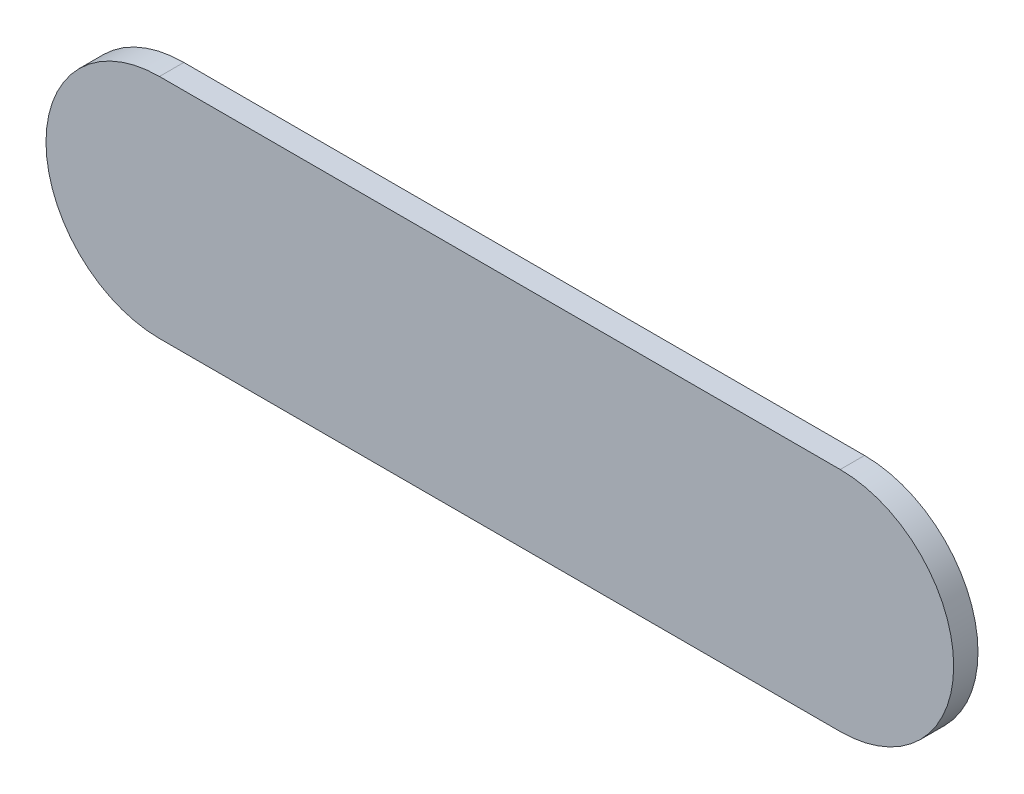
ISO-10303-21;
HEADER;
FILE_DESCRIPTION(('STEP AP214'),'2;1');
FILE_NAME('part.step','',(''),(''),'','','');
FILE_SCHEMA(('AUTOMOTIVE_DESIGN { 1 0 10303 214 1 1 1 1 }'));
ENDSEC;
DATA;
#1=APPLICATION_CONTEXT('core data for automotive mechanical design processes');
#2=APPLICATION_PROTOCOL_DEFINITION('international standard','automotive_design',2000,#1);
#3=PRODUCT_CONTEXT('',#1,'mechanical');
#4=PRODUCT('Part','Part','',(#3));
#5=PRODUCT_RELATED_PRODUCT_CATEGORY('part','',(#4));
#6=PRODUCT_DEFINITION_FORMATION('','',#4);
#7=PRODUCT_DEFINITION_CONTEXT('part definition',#1,'design');
#8=PRODUCT_DEFINITION('design','',#6,#7);
#9=PRODUCT_DEFINITION_SHAPE('','',#8);
#10=(LENGTH_UNIT() NAMED_UNIT(*) SI_UNIT(.MILLI.,.METRE.));
#11=(NAMED_UNIT(*) PLANE_ANGLE_UNIT() SI_UNIT($,.RADIAN.));
#12=(NAMED_UNIT(*) SI_UNIT($,.STERADIAN.) SOLID_ANGLE_UNIT());
#13=UNCERTAINTY_MEASURE_WITH_UNIT(LENGTH_MEASURE(1.E-05),#10,'distance_accuracy_value','');
#14=(GEOMETRIC_REPRESENTATION_CONTEXT(3) GLOBAL_UNCERTAINTY_ASSIGNED_CONTEXT((#13)) GLOBAL_UNIT_ASSIGNED_CONTEXT((#10,
#11,#12)) REPRESENTATION_CONTEXT('',''));
#15=CARTESIAN_POINT('',(0.,0.,0.));
#16=DIRECTION('',(0.,0.,1.));
#17=DIRECTION('',(1.,0.,0.));
#18=AXIS2_PLACEMENT_3D('',#15,#16,#17);
#19=CARTESIAN_POINT('',(3.118973394113,-2.491358894381,0.));
#20=DIRECTION('',(0.,-1.,0.));
#21=DIRECTION('',(1.,0.,0.));
#22=AXIS2_PLACEMENT_3D('',#19,#20,#21);
#23=PLANE('',#22);
#24=DIRECTION('',(-1.,0.,0.));
#25=VECTOR('',#24,1.);
#26=CARTESIAN_POINT('',(5.917853394113,-2.491358894381,0.));
#27=LINE('',#26,#25);
#28=CARTESIAN_POINT('',(5.917853394113,-2.491358894381,0.));
#29=VERTEX_POINT('',#28);
#30=CARTESIAN_POINT('',(3.118973394113,-2.491358894381,0.));
#31=VERTEX_POINT('',#30);
#32=EDGE_CURVE('E11',#29,#31,#27,.T.);
#33=ORIENTED_EDGE('',*,*,#32,.F.);
#34=DIRECTION('',(0.,0.,1.));
#35=VECTOR('',#34,1.);
#36=CARTESIAN_POINT('',(5.917853394113,-2.491358894381,0.));
#37=LINE('',#36,#35);
#38=CARTESIAN_POINT('',(5.917853394113,-2.491358894381,0.1));
#39=VERTEX_POINT('',#38);
#40=EDGE_CURVE('E24',#29,#39,#37,.T.);
#41=ORIENTED_EDGE('',*,*,#40,.T.);
#42=DIRECTION('',(1.,0.,0.));
#43=VECTOR('',#42,1.);
#44=CARTESIAN_POINT('',(5.917853394113,-2.491358894381,0.1));
#45=LINE('',#44,#43);
#46=CARTESIAN_POINT('',(3.118973394113,-2.491358894381,0.1));
#47=VERTEX_POINT('',#46);
#48=EDGE_CURVE('E75',#47,#39,#45,.T.);
#49=ORIENTED_EDGE('',*,*,#48,.F.);
#50=DIRECTION('',(0.,0.,1.));
#51=VECTOR('',#50,1.);
#52=CARTESIAN_POINT('',(3.118973394113,-2.491358894381,0.));
#53=LINE('',#52,#51);
#54=EDGE_CURVE('E85',#31,#47,#53,.T.);
#55=ORIENTED_EDGE('',*,*,#54,.F.);
#56=EDGE_LOOP('',(#33,#41,#49,#55));
#57=FACE_BOUND('',#56,.T.);
#58=ADVANCED_FACE('F17',(#57),#23,.T.);
#59=CARTESIAN_POINT('',(3.118973394113,-2.024798894381,0.));
#60=DIRECTION('',(0.,0.,1.));
#61=DIRECTION('',(0.,-1.,0.));
#62=AXIS2_PLACEMENT_3D('',#59,#60,#61);
#63=CYLINDRICAL_SURFACE('',#62,0.466560000000001);
#64=CARTESIAN_POINT('',(3.118973394113,-2.024798894381,0.));
#65=DIRECTION('',(0.,0.,-1.));
#66=DIRECTION('',(1.,0.,0.));
#67=AXIS2_PLACEMENT_3D('',#64,#65,#66);
#68=CIRCLE('',#67,0.466560000000001);
#69=CARTESIAN_POINT('',(3.118973394113,-1.558238894381,0.));
#70=VERTEX_POINT('',#69);
#71=EDGE_CURVE('E83',#31,#70,#68,.T.);
#72=ORIENTED_EDGE('',*,*,#71,.F.);
#73=ORIENTED_EDGE('',*,*,#54,.T.);
#74=CARTESIAN_POINT('',(3.118973394113,-2.024798894381,0.1));
#75=DIRECTION('',(0.,0.,1.));
#76=DIRECTION('',(0.,-1.,0.));
#77=AXIS2_PLACEMENT_3D('',#74,#75,#76);
#78=CIRCLE('',#77,0.466560000000001);
#79=CARTESIAN_POINT('',(3.118973394113,-1.558238894381,0.1));
#80=VERTEX_POINT('',#79);
#81=EDGE_CURVE('E81',#80,#47,#78,.T.);
#82=ORIENTED_EDGE('',*,*,#81,.F.);
#83=DIRECTION('',(0.,0.,1.));
#84=VECTOR('',#83,1.);
#85=CARTESIAN_POINT('',(3.118973394113,-1.558238894381,0.));
#86=LINE('',#85,#84);
#87=EDGE_CURVE('E61',#70,#80,#86,.T.);
#88=ORIENTED_EDGE('',*,*,#87,.F.);
#89=EDGE_LOOP('',(#72,#73,#82,#88));
#90=FACE_BOUND('',#89,.T.);
#91=ADVANCED_FACE('F91',(#90),#63,.T.);
#92=CARTESIAN_POINT('',(5.917853394113,-1.558238894381,0.));
#93=DIRECTION('',(0.,1.,0.));
#94=DIRECTION('',(-1.,0.,0.));
#95=AXIS2_PLACEMENT_3D('',#92,#93,#94);
#96=PLANE('',#95);
#97=DIRECTION('',(1.,0.,0.));
#98=VECTOR('',#97,1.);
#99=CARTESIAN_POINT('',(3.118973394113,-1.558238894381,0.));
#100=LINE('',#99,#98);
#101=CARTESIAN_POINT('',(5.917853394113,-1.558238894381,0.));
#102=VERTEX_POINT('',#101);
#103=EDGE_CURVE('E65',#70,#102,#100,.T.);
#104=ORIENTED_EDGE('',*,*,#103,.F.);
#105=ORIENTED_EDGE('',*,*,#87,.T.);
#106=DIRECTION('',(-1.,0.,0.));
#107=VECTOR('',#106,1.);
#108=CARTESIAN_POINT('',(3.118973394113,-1.558238894381,0.1));
#109=LINE('',#108,#107);
#110=CARTESIAN_POINT('',(5.917853394113,-1.558238894381,0.1));
#111=VERTEX_POINT('',#110);
#112=EDGE_CURVE('E54',#111,#80,#109,.T.);
#113=ORIENTED_EDGE('',*,*,#112,.F.);
#114=DIRECTION('',(0.,0.,1.));
#115=VECTOR('',#114,1.);
#116=CARTESIAN_POINT('',(5.917853394113,-1.558238894381,0.));
#117=LINE('',#116,#115);
#118=EDGE_CURVE('E58',#102,#111,#117,.T.);
#119=ORIENTED_EDGE('',*,*,#118,.F.);
#120=EDGE_LOOP('',(#104,#105,#113,#119));
#121=FACE_BOUND('',#120,.T.);
#122=ADVANCED_FACE('F57',(#121),#96,.T.);
#123=CARTESIAN_POINT('',(5.917853394113,-2.024798894381,0.));
#124=DIRECTION('',(0.,0.,1.));
#125=DIRECTION('',(0.,1.,0.));
#126=AXIS2_PLACEMENT_3D('',#123,#124,#125);
#127=CYLINDRICAL_SURFACE('',#126,0.466559999999999);
#128=CARTESIAN_POINT('',(5.917853394113,-2.024798894381,0.));
#129=DIRECTION('',(0.,0.,-1.));
#130=DIRECTION('',(0.,1.,0.));
#131=AXIS2_PLACEMENT_3D('',#128,#129,#130);
#132=CIRCLE('',#131,0.466559999999999);
#133=EDGE_CURVE('E71',#102,#29,#132,.T.);
#134=ORIENTED_EDGE('',*,*,#133,.F.);
#135=ORIENTED_EDGE('',*,*,#118,.T.);
#136=CARTESIAN_POINT('',(5.917853394113,-2.024798894381,0.1));
#137=DIRECTION('',(0.,0.,1.));
#138=DIRECTION('',(0.,1.,0.));
#139=AXIS2_PLACEMENT_3D('',#136,#137,#138);
#140=CIRCLE('',#139,0.466559999999999);
#141=EDGE_CURVE('E70',#39,#111,#140,.T.);
#142=ORIENTED_EDGE('',*,*,#141,.F.);
#143=ORIENTED_EDGE('',*,*,#40,.F.);
#144=EDGE_LOOP('',(#134,#135,#142,#143));
#145=FACE_BOUND('',#144,.T.);
#146=ADVANCED_FACE('F69',(#145),#127,.T.);
#147=CARTESIAN_POINT('',(4.518413394113,-2.024798894381,0.));
#148=DIRECTION('',(0.,0.,1.));
#149=DIRECTION('',(1.,0.,0.));
#150=AXIS2_PLACEMENT_3D('',#147,#148,#149);
#151=PLANE('',#150);
#152=ORIENTED_EDGE('',*,*,#133,.T.);
#153=ORIENTED_EDGE('',*,*,#32,.T.);
#154=ORIENTED_EDGE('',*,*,#71,.T.);
#155=ORIENTED_EDGE('',*,*,#103,.T.);
#156=EDGE_LOOP('',(#152,#153,#154,#155));
#157=FACE_BOUND('',#156,.T.);
#158=ADVANCED_FACE('F88',(#157),#151,.F.);
#159=CARTESIAN_POINT('',(4.518413394113,-2.024798894381,0.1));
#160=DIRECTION('',(0.,0.,1.));
#161=DIRECTION('',(1.,0.,0.));
#162=AXIS2_PLACEMENT_3D('',#159,#160,#161);
#163=PLANE('',#162);
#164=ORIENTED_EDGE('',*,*,#141,.T.);
#165=ORIENTED_EDGE('',*,*,#112,.T.);
#166=ORIENTED_EDGE('',*,*,#81,.T.);
#167=ORIENTED_EDGE('',*,*,#48,.T.);
#168=EDGE_LOOP('',(#164,#165,#166,#167));
#169=FACE_BOUND('',#168,.T.);
#170=ADVANCED_FACE('F74',(#169),#163,.T.);
#171=CLOSED_SHELL('',(#58,#91,#122,#146,#158,#170));
#172=MANIFOLD_SOLID_BREP('B1',#171);
#173=ADVANCED_BREP_SHAPE_REPRESENTATION('',(#18,#172),#14);
#174=SHAPE_DEFINITION_REPRESENTATION(#9,#173);
ENDSEC;
END-ISO-10303-21;
